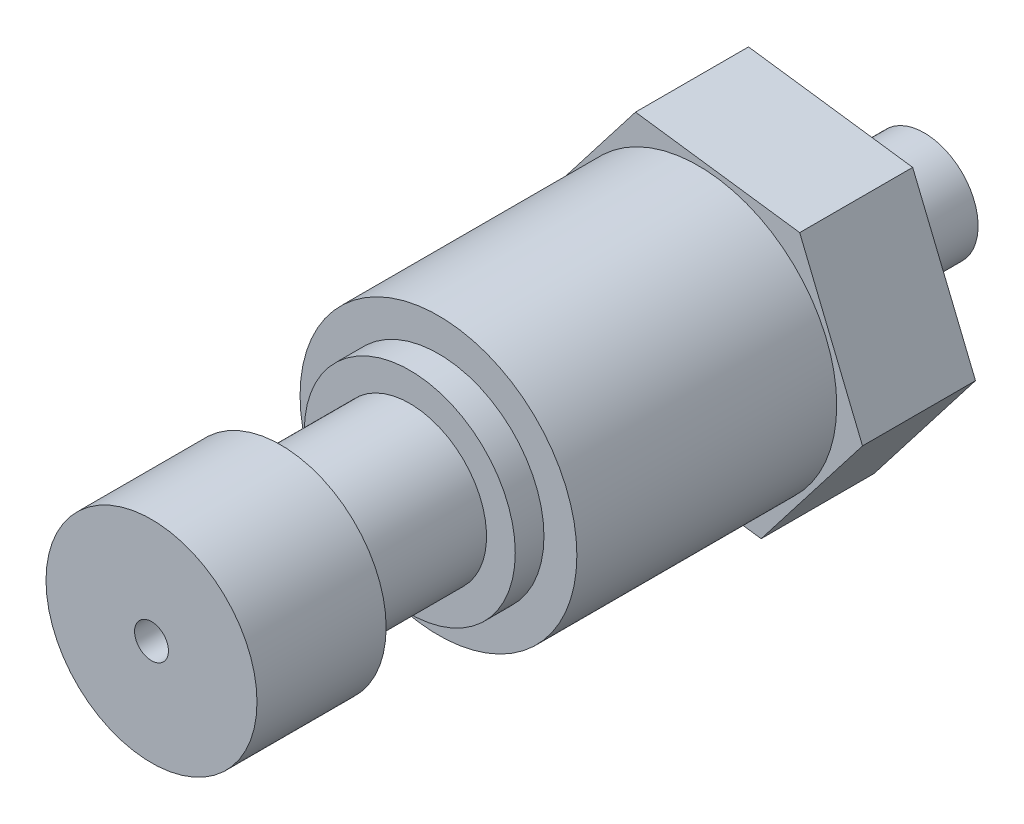
ISO-10303-21;
HEADER;
FILE_DESCRIPTION(('STEP AP214'),'2;1');
FILE_NAME('part.step','',(''),(''),'','','');
FILE_SCHEMA(('AUTOMOTIVE_DESIGN { 1 0 10303 214 1 1 1 1 }'));
ENDSEC;
DATA;
#1=APPLICATION_CONTEXT('core data for automotive mechanical design processes');
#2=APPLICATION_PROTOCOL_DEFINITION('international standard','automotive_design',2000,#1);
#3=PRODUCT_CONTEXT('',#1,'mechanical');
#4=PRODUCT('Part','Part','',(#3));
#5=PRODUCT_RELATED_PRODUCT_CATEGORY('part','',(#4));
#6=PRODUCT_DEFINITION_FORMATION('','',#4);
#7=PRODUCT_DEFINITION_CONTEXT('part definition',#1,'design');
#8=PRODUCT_DEFINITION('design','',#6,#7);
#9=PRODUCT_DEFINITION_SHAPE('','',#8);
#10=(LENGTH_UNIT() NAMED_UNIT(*) SI_UNIT(.MILLI.,.METRE.));
#11=(NAMED_UNIT(*) PLANE_ANGLE_UNIT() SI_UNIT($,.RADIAN.));
#12=(NAMED_UNIT(*) SI_UNIT($,.STERADIAN.) SOLID_ANGLE_UNIT());
#13=UNCERTAINTY_MEASURE_WITH_UNIT(LENGTH_MEASURE(1.E-05),#10,'distance_accuracy_value','');
#14=(GEOMETRIC_REPRESENTATION_CONTEXT(3) GLOBAL_UNCERTAINTY_ASSIGNED_CONTEXT((#13)) GLOBAL_UNIT_ASSIGNED_CONTEXT((#10,
#11,#12)) REPRESENTATION_CONTEXT('',''));
#15=CARTESIAN_POINT('',(0.,0.,0.));
#16=DIRECTION('',(0.,0.,1.));
#17=DIRECTION('',(1.,0.,0.));
#18=AXIS2_PLACEMENT_3D('',#15,#16,#17);
#19=CARTESIAN_POINT('',(5.56012094670705,-13.5697600712512,10.));
#20=DIRECTION('',(-0.79102119547338,0.611788744839152,0.));
#21=DIRECTION('',(-0.611788744839152,-0.79102119547338,0.));
#22=AXIS2_PLACEMENT_3D('',#19,#20,#21);
#23=PLANE('',#22);
#24=DIRECTION('',(0.611788744839152,0.79102119547338,0.));
#25=VECTOR('',#24,1.);
#26=CARTESIAN_POINT('',(5.56012094670705,-13.5697600712512,0.));
#27=LINE('',#26,#25);
#28=CARTESIAN_POINT('',(5.56012094670705,-13.5697600712512,0.));
#29=VERTEX_POINT('',#28);
#30=CARTESIAN_POINT('',(14.5318174183168,-1.96967404766329,0.));
#31=VERTEX_POINT('',#30);
#32=EDGE_CURVE('E137',#29,#31,#27,.T.);
#33=ORIENTED_EDGE('',*,*,#32,.T.);
#34=DIRECTION('',(0.,0.,-1.));
#35=VECTOR('',#34,1.);
#36=CARTESIAN_POINT('',(14.5318174183168,-1.96967404766329,10.));
#37=LINE('',#36,#35);
#38=CARTESIAN_POINT('',(14.5318174183168,-1.96967404766329,10.));
#39=VERTEX_POINT('',#38);
#40=EDGE_CURVE('E48',#39,#31,#37,.T.);
#41=ORIENTED_EDGE('',*,*,#40,.F.);
#42=DIRECTION('',(0.611788744839152,0.79102119547338,0.));
#43=VECTOR('',#42,1.);
#44=CARTESIAN_POINT('',(5.56012094670705,-13.5697600712512,10.));
#45=LINE('',#44,#43);
#46=CARTESIAN_POINT('',(5.56012094670705,-13.5697600712512,10.));
#47=VERTEX_POINT('',#46);
#48=EDGE_CURVE('E154',#47,#39,#45,.T.);
#49=ORIENTED_EDGE('',*,*,#48,.F.);
#50=DIRECTION('',(0.,0.,-1.));
#51=VECTOR('',#50,1.);
#52=CARTESIAN_POINT('',(5.56012094670705,-13.5697600712512,10.));
#53=LINE('',#52,#51);
#54=EDGE_CURVE('E133',#47,#29,#53,.T.);
#55=ORIENTED_EDGE('',*,*,#54,.T.);
#56=EDGE_LOOP('',(#33,#41,#49,#55));
#57=FACE_BOUND('',#56,.T.);
#58=ADVANCED_FACE('F45',(#57),#23,.F.);
#59=CARTESIAN_POINT('',(14.5318174183168,-1.96967404766329,10.));
#60=DIRECTION('',(-0.925335192516792,-0.379150077792306,0.));
#61=DIRECTION('',(0.379150077792306,-0.925335192516792,0.));
#62=AXIS2_PLACEMENT_3D('',#59,#60,#61);
#63=PLANE('',#62);
#64=DIRECTION('',(-0.379150077792306,0.925335192516792,0.));
#65=VECTOR('',#64,1.);
#66=CARTESIAN_POINT('',(14.5318174183168,-1.96967404766329,0.));
#67=LINE('',#66,#65);
#68=CARTESIAN_POINT('',(8.97169647160972,11.6000860235879,0.));
#69=VERTEX_POINT('',#68);
#70=EDGE_CURVE('E141',#31,#69,#67,.T.);
#71=ORIENTED_EDGE('',*,*,#70,.T.);
#72=DIRECTION('',(0.,0.,-1.));
#73=VECTOR('',#72,1.);
#74=CARTESIAN_POINT('',(8.97169647160972,11.6000860235879,10.));
#75=LINE('',#74,#73);
#76=CARTESIAN_POINT('',(8.97169647160972,11.6000860235879,10.));
#77=VERTEX_POINT('',#76);
#78=EDGE_CURVE('E160',#77,#69,#75,.T.);
#79=ORIENTED_EDGE('',*,*,#78,.F.);
#80=DIRECTION('',(-0.379150077792306,0.925335192516792,0.));
#81=VECTOR('',#80,1.);
#82=CARTESIAN_POINT('',(14.5318174183168,-1.96967404766329,10.));
#83=LINE('',#82,#81);
#84=EDGE_CURVE('E102',#39,#77,#83,.T.);
#85=ORIENTED_EDGE('',*,*,#84,.F.);
#86=ORIENTED_EDGE('',*,*,#40,.T.);
#87=EDGE_LOOP('',(#71,#79,#85,#86));
#88=FACE_BOUND('',#87,.T.);
#89=ADVANCED_FACE('F241',(#88),#63,.F.);
#90=CARTESIAN_POINT('',(8.97169647160972,11.6000860235879,10.));
#91=DIRECTION('',(-0.134313997043412,-0.990938822631459,0.));
#92=DIRECTION('',(0.990938822631459,-0.134313997043412,0.));
#93=AXIS2_PLACEMENT_3D('',#90,#91,#92);
#94=PLANE('',#93);
#95=DIRECTION('',(-0.990938822631459,0.134313997043412,0.));
#96=VECTOR('',#95,1.);
#97=CARTESIAN_POINT('',(8.97169647160972,11.6000860235879,0.));
#98=LINE('',#97,#96);
#99=CARTESIAN_POINT('',(-5.56012094670705,13.5697600712512,0.));
#100=VERTEX_POINT('',#99);
#101=EDGE_CURVE('E145',#69,#100,#98,.T.);
#102=ORIENTED_EDGE('',*,*,#101,.T.);
#103=DIRECTION('',(0.,0.,-1.));
#104=VECTOR('',#103,1.);
#105=CARTESIAN_POINT('',(-5.56012094670705,13.5697600712512,10.));
#106=LINE('',#105,#104);
#107=CARTESIAN_POINT('',(-5.56012094670705,13.5697600712512,10.));
#108=VERTEX_POINT('',#107);
#109=EDGE_CURVE('E126',#108,#100,#106,.T.);
#110=ORIENTED_EDGE('',*,*,#109,.F.);
#111=DIRECTION('',(-0.990938822631459,0.134313997043412,0.));
#112=VECTOR('',#111,1.);
#113=CARTESIAN_POINT('',(8.97169647160972,11.6000860235879,10.));
#114=LINE('',#113,#112);
#115=EDGE_CURVE('E115',#77,#108,#114,.T.);
#116=ORIENTED_EDGE('',*,*,#115,.F.);
#117=ORIENTED_EDGE('',*,*,#78,.T.);
#118=EDGE_LOOP('',(#102,#110,#116,#117));
#119=FACE_BOUND('',#118,.T.);
#120=ADVANCED_FACE('F246',(#119),#94,.F.);
#121=CARTESIAN_POINT('',(-5.56012094670705,13.5697600712512,10.));
#122=DIRECTION('',(0.791021195473379,-0.611788744839153,0.));
#123=DIRECTION('',(0.611788744839153,0.791021195473379,0.));
#124=AXIS2_PLACEMENT_3D('',#121,#122,#123);
#125=PLANE('',#124);
#126=DIRECTION('',(-0.611788744839153,-0.791021195473379,0.));
#127=VECTOR('',#126,1.);
#128=CARTESIAN_POINT('',(-5.56012094670705,13.5697600712512,0.));
#129=LINE('',#128,#127);
#130=CARTESIAN_POINT('',(-14.5318174183168,1.9696740476633,0.));
#131=VERTEX_POINT('',#130);
#132=EDGE_CURVE('E124',#100,#131,#129,.T.);
#133=ORIENTED_EDGE('',*,*,#132,.T.);
#134=DIRECTION('',(0.,0.,-1.));
#135=VECTOR('',#134,1.);
#136=CARTESIAN_POINT('',(-14.5318174183168,1.9696740476633,10.));
#137=LINE('',#136,#135);
#138=CARTESIAN_POINT('',(-14.5318174183168,1.9696740476633,10.));
#139=VERTEX_POINT('',#138);
#140=EDGE_CURVE('E121',#139,#131,#137,.T.);
#141=ORIENTED_EDGE('',*,*,#140,.F.);
#142=DIRECTION('',(-0.611788744839153,-0.791021195473379,0.));
#143=VECTOR('',#142,1.);
#144=CARTESIAN_POINT('',(-5.56012094670705,13.5697600712512,10.));
#145=LINE('',#144,#143);
#146=EDGE_CURVE('E109',#108,#139,#145,.T.);
#147=ORIENTED_EDGE('',*,*,#146,.F.);
#148=ORIENTED_EDGE('',*,*,#109,.T.);
#149=EDGE_LOOP('',(#133,#141,#147,#148));
#150=FACE_BOUND('',#149,.T.);
#151=ADVANCED_FACE('F122',(#150),#125,.F.);
#152=CARTESIAN_POINT('',(-14.5318174183168,1.9696740476633,10.));
#153=DIRECTION('',(0.925335192516792,0.379150077792306,0.));
#154=DIRECTION('',(-0.379150077792306,0.925335192516792,0.));
#155=AXIS2_PLACEMENT_3D('',#152,#153,#154);
#156=PLANE('',#155);
#157=DIRECTION('',(0.379150077792306,-0.925335192516792,0.));
#158=VECTOR('',#157,1.);
#159=CARTESIAN_POINT('',(-14.5318174183168,1.9696740476633,0.));
#160=LINE('',#159,#158);
#161=CARTESIAN_POINT('',(-8.97169647160973,-11.6000860235879,0.));
#162=VERTEX_POINT('',#161);
#163=EDGE_CURVE('E87',#131,#162,#160,.T.);
#164=ORIENTED_EDGE('',*,*,#163,.T.);
#165=DIRECTION('',(0.,0.,-1.));
#166=VECTOR('',#165,1.);
#167=CARTESIAN_POINT('',(-8.97169647160973,-11.6000860235879,10.));
#168=LINE('',#167,#166);
#169=CARTESIAN_POINT('',(-8.97169647160973,-11.6000860235879,10.));
#170=VERTEX_POINT('',#169);
#171=EDGE_CURVE('E127',#170,#162,#168,.T.);
#172=ORIENTED_EDGE('',*,*,#171,.F.);
#173=DIRECTION('',(0.379150077792306,-0.925335192516792,0.));
#174=VECTOR('',#173,1.);
#175=CARTESIAN_POINT('',(-14.5318174183168,1.9696740476633,10.));
#176=LINE('',#175,#174);
#177=EDGE_CURVE('E113',#139,#170,#176,.T.);
#178=ORIENTED_EDGE('',*,*,#177,.F.);
#179=ORIENTED_EDGE('',*,*,#140,.T.);
#180=EDGE_LOOP('',(#164,#172,#178,#179));
#181=FACE_BOUND('',#180,.T.);
#182=ADVANCED_FACE('F129',(#181),#156,.F.);
#183=CARTESIAN_POINT('',(-8.97169647160973,-11.6000860235879,10.));
#184=DIRECTION('',(0.134313997043413,0.990938822631459,0.));
#185=DIRECTION('',(-0.990938822631459,0.134313997043413,0.));
#186=AXIS2_PLACEMENT_3D('',#183,#184,#185);
#187=PLANE('',#186);
#188=DIRECTION('',(0.990938822631459,-0.134313997043413,0.));
#189=VECTOR('',#188,1.);
#190=CARTESIAN_POINT('',(-8.97169647160973,-11.6000860235879,0.));
#191=LINE('',#190,#189);
#192=EDGE_CURVE('E93',#162,#29,#191,.T.);
#193=ORIENTED_EDGE('',*,*,#192,.T.);
#194=ORIENTED_EDGE('',*,*,#54,.F.);
#195=DIRECTION('',(0.990938822631459,-0.134313997043413,0.));
#196=VECTOR('',#195,1.);
#197=CARTESIAN_POINT('',(-8.97169647160973,-11.6000860235879,10.));
#198=LINE('',#197,#196);
#199=EDGE_CURVE('E64',#170,#47,#198,.T.);
#200=ORIENTED_EDGE('',*,*,#199,.F.);
#201=ORIENTED_EDGE('',*,*,#171,.T.);
#202=EDGE_LOOP('',(#193,#194,#200,#201));
#203=FACE_BOUND('',#202,.T.);
#204=ADVANCED_FACE('F259',(#203),#187,.F.);
#205=CARTESIAN_POINT('',(0.,0.,10.));
#206=DIRECTION('',(0.,0.,1.));
#207=DIRECTION('',(1.,0.,0.));
#208=AXIS2_PLACEMENT_3D('',#205,#206,#207);
#209=PLANE('',#208);
#210=CARTESIAN_POINT('',(0.,0.,10.));
#211=DIRECTION('',(0.,0.,1.));
#212=DIRECTION('',(1.,0.,0.));
#213=AXIS2_PLACEMENT_3D('',#210,#211,#212);
#214=CIRCLE('',#213,12.25);
#215=CARTESIAN_POINT('',(12.25,0.,10.));
#216=VERTEX_POINT('',#215);
#217=EDGE_CURVE('E166',#216,#216,#214,.T.);
#218=ORIENTED_EDGE('',*,*,#217,.F.);
#219=EDGE_LOOP('',(#218));
#220=FACE_BOUND('',#219,.T.);
#221=ORIENTED_EDGE('',*,*,#48,.T.);
#222=ORIENTED_EDGE('',*,*,#84,.T.);
#223=ORIENTED_EDGE('',*,*,#115,.T.);
#224=ORIENTED_EDGE('',*,*,#146,.T.);
#225=ORIENTED_EDGE('',*,*,#177,.T.);
#226=ORIENTED_EDGE('',*,*,#199,.T.);
#227=EDGE_LOOP('',(#221,#222,#223,#224,#225,#226));
#228=FACE_BOUND('',#227,.T.);
#229=ADVANCED_FACE('F111',(#220,#228),#209,.T.);
#230=CARTESIAN_POINT('',(0.,0.,0.));
#231=DIRECTION('',(0.,0.,1.));
#232=DIRECTION('',(1.,0.,0.));
#233=AXIS2_PLACEMENT_3D('',#230,#231,#232);
#234=PLANE('',#233);
#235=CARTESIAN_POINT('',(0.,0.,0.));
#236=DIRECTION('',(0.,0.,-1.));
#237=DIRECTION('',(-1.,0.,0.));
#238=AXIS2_PLACEMENT_3D('',#235,#236,#237);
#239=CIRCLE('',#238,4.7625);
#240=CARTESIAN_POINT('',(-4.7625,0.,0.));
#241=VERTEX_POINT('',#240);
#242=EDGE_CURVE('E170',#241,#241,#239,.T.);
#243=ORIENTED_EDGE('',*,*,#242,.F.);
#244=EDGE_LOOP('',(#243));
#245=FACE_BOUND('',#244,.T.);
#246=ORIENTED_EDGE('',*,*,#32,.F.);
#247=ORIENTED_EDGE('',*,*,#192,.F.);
#248=ORIENTED_EDGE('',*,*,#163,.F.);
#249=ORIENTED_EDGE('',*,*,#132,.F.);
#250=ORIENTED_EDGE('',*,*,#101,.F.);
#251=ORIENTED_EDGE('',*,*,#70,.F.);
#252=EDGE_LOOP('',(#246,#247,#248,#249,#250,#251));
#253=FACE_BOUND('',#252,.T.);
#254=ADVANCED_FACE('F231',(#245,#253),#234,.F.);
#255=CARTESIAN_POINT('',(0.,0.,33.));
#256=DIRECTION('',(0.,0.,-1.));
#257=DIRECTION('',(-1.,0.,0.));
#258=AXIS2_PLACEMENT_3D('',#255,#256,#257);
#259=CYLINDRICAL_SURFACE('',#258,12.25);
#260=CARTESIAN_POINT('',(0.,0.,33.));
#261=DIRECTION('',(0.,0.,1.));
#262=DIRECTION('',(1.,0.,0.));
#263=AXIS2_PLACEMENT_3D('',#260,#261,#262);
#264=CIRCLE('',#263,12.25);
#265=CARTESIAN_POINT('',(12.25,0.,33.));
#266=VERTEX_POINT('',#265);
#267=EDGE_CURVE('E142',#266,#266,#264,.T.);
#268=ORIENTED_EDGE('',*,*,#267,.F.);
#269=EDGE_LOOP('',(#268));
#270=FACE_BOUND('',#269,.T.);
#271=ORIENTED_EDGE('',*,*,#217,.T.);
#272=EDGE_LOOP('',(#271));
#273=FACE_BOUND('',#272,.T.);
#274=ADVANCED_FACE('F226',(#270,#273),#259,.T.);
#275=CARTESIAN_POINT('',(0.,0.,33.));
#276=DIRECTION('',(0.,0.,1.));
#277=DIRECTION('',(1.,0.,0.));
#278=AXIS2_PLACEMENT_3D('',#275,#276,#277);
#279=PLANE('',#278);
#280=CARTESIAN_POINT('',(0.,0.,33.));
#281=DIRECTION('',(0.,0.,1.));
#282=DIRECTION('',(1.,0.,0.));
#283=AXIS2_PLACEMENT_3D('',#280,#281,#282);
#284=CIRCLE('',#283,9.33749047328459);
#285=CARTESIAN_POINT('',(9.33749047328459,0.,33.));
#286=VERTEX_POINT('',#285);
#287=EDGE_CURVE('E55',#286,#286,#284,.T.);
#288=ORIENTED_EDGE('',*,*,#287,.F.);
#289=EDGE_LOOP('',(#288));
#290=FACE_BOUND('',#289,.T.);
#291=ORIENTED_EDGE('',*,*,#267,.T.);
#292=EDGE_LOOP('',(#291));
#293=FACE_BOUND('',#292,.T.);
#294=ADVANCED_FACE('F222',(#290,#293),#279,.T.);
#295=CARTESIAN_POINT('',(0.,0.,-10.));
#296=DIRECTION('',(0.,0.,1.));
#297=DIRECTION('',(1.,0.,0.));
#298=AXIS2_PLACEMENT_3D('',#295,#296,#297);
#299=CYLINDRICAL_SURFACE('',#298,4.7625);
#300=CARTESIAN_POINT('',(0.,0.,-10.));
#301=DIRECTION('',(0.,0.,-1.));
#302=DIRECTION('',(-1.,0.,0.));
#303=AXIS2_PLACEMENT_3D('',#300,#301,#302);
#304=CIRCLE('',#303,4.7625);
#305=CARTESIAN_POINT('',(-4.7625,0.,-10.));
#306=VERTEX_POINT('',#305);
#307=EDGE_CURVE('E186',#306,#306,#304,.T.);
#308=ORIENTED_EDGE('',*,*,#307,.F.);
#309=EDGE_LOOP('',(#308));
#310=FACE_BOUND('',#309,.T.);
#311=ORIENTED_EDGE('',*,*,#242,.T.);
#312=EDGE_LOOP('',(#311));
#313=FACE_BOUND('',#312,.T.);
#314=ADVANCED_FACE('F225',(#310,#313),#299,.T.);
#315=CARTESIAN_POINT('',(0.,0.,-10.));
#316=DIRECTION('',(0.,0.,-1.));
#317=DIRECTION('',(-1.,0.,0.));
#318=AXIS2_PLACEMENT_3D('',#315,#316,#317);
#319=PLANE('',#318);
#320=CARTESIAN_POINT('',(0.,0.,-9.99999999999999));
#321=DIRECTION('',(0.,0.,1.));
#322=DIRECTION('',(1.,0.,0.));
#323=AXIS2_PLACEMENT_3D('',#320,#321,#322);
#324=CIRCLE('',#323,1.5);
#325=CARTESIAN_POINT('',(1.5,0.,-9.99999999999999));
#326=VERTEX_POINT('',#325);
#327=EDGE_CURVE('E205',#326,#326,#324,.T.);
#328=ORIENTED_EDGE('',*,*,#327,.T.);
#329=EDGE_LOOP('',(#328));
#330=FACE_BOUND('',#329,.T.);
#331=ORIENTED_EDGE('',*,*,#307,.T.);
#332=EDGE_LOOP('',(#331));
#333=FACE_BOUND('',#332,.T.);
#334=ADVANCED_FACE('F319',(#330,#333),#319,.T.);
#335=CARTESIAN_POINT('',(0.,0.,35.54));
#336=DIRECTION('',(0.,0.,-1.));
#337=DIRECTION('',(-1.,0.,0.));
#338=AXIS2_PLACEMENT_3D('',#335,#336,#337);
#339=CYLINDRICAL_SURFACE('',#338,9.33749047328459);
#340=CARTESIAN_POINT('',(0.,0.,35.54));
#341=DIRECTION('',(0.,0.,1.));
#342=DIRECTION('',(1.,0.,0.));
#343=AXIS2_PLACEMENT_3D('',#340,#341,#342);
#344=CIRCLE('',#343,9.33749047328459);
#345=CARTESIAN_POINT('',(9.33749047328459,0.,35.54));
#346=VERTEX_POINT('',#345);
#347=EDGE_CURVE('E189',#346,#346,#344,.T.);
#348=ORIENTED_EDGE('',*,*,#347,.F.);
#349=EDGE_LOOP('',(#348));
#350=FACE_BOUND('',#349,.T.);
#351=ORIENTED_EDGE('',*,*,#287,.T.);
#352=EDGE_LOOP('',(#351));
#353=FACE_BOUND('',#352,.T.);
#354=ADVANCED_FACE('F220',(#350,#353),#339,.T.);
#355=CARTESIAN_POINT('',(0.,0.,35.54));
#356=DIRECTION('',(0.,0.,1.));
#357=DIRECTION('',(1.,0.,0.));
#358=AXIS2_PLACEMENT_3D('',#355,#356,#357);
#359=PLANE('',#358);
#360=CARTESIAN_POINT('',(0.,0.,35.54));
#361=DIRECTION('',(0.,0.,1.));
#362=DIRECTION('',(1.,0.,0.));
#363=AXIS2_PLACEMENT_3D('',#360,#361,#362);
#364=CIRCLE('',#363,6.7937183173805);
#365=CARTESIAN_POINT('',(-6.7937183173805,0.,35.54));
#366=VERTEX_POINT('',#365);
#367=EDGE_CURVE('E11',#366,#366,#364,.T.);
#368=ORIENTED_EDGE('',*,*,#367,.F.);
#369=EDGE_LOOP('',(#368));
#370=FACE_BOUND('',#369,.T.);
#371=ORIENTED_EDGE('',*,*,#347,.T.);
#372=EDGE_LOOP('',(#371));
#373=FACE_BOUND('',#372,.T.);
#374=ADVANCED_FACE('F336',(#370,#373),#359,.T.);
#375=CARTESIAN_POINT('',(0.,0.,46.97));
#376=DIRECTION('',(0.,0.,-1.));
#377=DIRECTION('',(-1.,0.,0.));
#378=AXIS2_PLACEMENT_3D('',#375,#376,#377);
#379=CYLINDRICAL_SURFACE('',#378,6.7937183173805);
#380=CARTESIAN_POINT('',(0.,0.,46.97));
#381=DIRECTION('',(0.,0.,1.));
#382=DIRECTION('',(1.,0.,0.));
#383=AXIS2_PLACEMENT_3D('',#380,#381,#382);
#384=CIRCLE('',#383,6.7937183173805);
#385=CARTESIAN_POINT('',(-6.7937183173805,0.,46.97));
#386=VERTEX_POINT('',#385);
#387=EDGE_CURVE('E193',#386,#386,#384,.T.);
#388=CARTESIAN_POINT('',(-6.7937183173805,0.,46.97));
#389=CARTESIAN_POINT('',(-6.7937183173805,0.,46.8509375));
#390=CARTESIAN_POINT('',(-6.7937183173805,0.,46.731875));
#391=CARTESIAN_POINT('',(-6.7937183173805,0.,46.49375));
#392=CARTESIAN_POINT('',(-6.7937183173805,0.,46.3746875));
#393=CARTESIAN_POINT('',(-6.7937183173805,0.,46.1365625));
#394=CARTESIAN_POINT('',(-6.7937183173805,0.,46.0175));
#395=CARTESIAN_POINT('',(-6.7937183173805,0.,45.779375));
#396=CARTESIAN_POINT('',(-6.7937183173805,0.,45.6603125));
#397=CARTESIAN_POINT('',(-6.7937183173805,0.,45.4221875));
#398=CARTESIAN_POINT('',(-6.7937183173805,0.,45.303125));
#399=CARTESIAN_POINT('',(-6.7937183173805,0.,45.065));
#400=CARTESIAN_POINT('',(-6.7937183173805,0.,44.9459375));
#401=CARTESIAN_POINT('',(-6.7937183173805,0.,44.7078125));
#402=CARTESIAN_POINT('',(-6.7937183173805,0.,44.58875));
#403=CARTESIAN_POINT('',(-6.7937183173805,0.,44.350625));
#404=CARTESIAN_POINT('',(-6.7937183173805,0.,44.2315625));
#405=CARTESIAN_POINT('',(-6.7937183173805,0.,43.9934375));
#406=CARTESIAN_POINT('',(-6.7937183173805,0.,43.874375));
#407=CARTESIAN_POINT('',(-6.7937183173805,0.,43.63625));
#408=CARTESIAN_POINT('',(-6.7937183173805,0.,43.5171875));
#409=CARTESIAN_POINT('',(-6.7937183173805,0.,43.2790625));
#410=CARTESIAN_POINT('',(-6.7937183173805,0.,43.16));
#411=CARTESIAN_POINT('',(-6.7937183173805,0.,42.921875));
#412=CARTESIAN_POINT('',(-6.7937183173805,0.,42.8028125));
#413=CARTESIAN_POINT('',(-6.7937183173805,0.,42.5646875));
#414=CARTESIAN_POINT('',(-6.7937183173805,0.,42.445625));
#415=CARTESIAN_POINT('',(-6.7937183173805,0.,42.2075));
#416=CARTESIAN_POINT('',(-6.7937183173805,0.,42.0884375));
#417=CARTESIAN_POINT('',(-6.7937183173805,0.,41.8503125));
#418=CARTESIAN_POINT('',(-6.7937183173805,0.,41.73125));
#419=CARTESIAN_POINT('',(-6.7937183173805,0.,41.493125));
#420=CARTESIAN_POINT('',(-6.7937183173805,0.,41.3740625));
#421=CARTESIAN_POINT('',(-6.7937183173805,0.,41.1359375));
#422=CARTESIAN_POINT('',(-6.7937183173805,0.,41.016875));
#423=CARTESIAN_POINT('',(-6.7937183173805,0.,40.77875));
#424=CARTESIAN_POINT('',(-6.7937183173805,0.,40.6596875));
#425=CARTESIAN_POINT('',(-6.7937183173805,0.,40.4215625));
#426=CARTESIAN_POINT('',(-6.7937183173805,0.,40.3025));
#427=CARTESIAN_POINT('',(-6.7937183173805,0.,40.064375));
#428=CARTESIAN_POINT('',(-6.7937183173805,0.,39.9453125));
#429=CARTESIAN_POINT('',(-6.7937183173805,0.,39.7071875));
#430=CARTESIAN_POINT('',(-6.7937183173805,0.,39.588125));
#431=CARTESIAN_POINT('',(-6.7937183173805,0.,39.35));
#432=CARTESIAN_POINT('',(-6.7937183173805,0.,39.2309375));
#433=CARTESIAN_POINT('',(-6.7937183173805,0.,38.9928125));
#434=CARTESIAN_POINT('',(-6.7937183173805,0.,38.87375));
#435=CARTESIAN_POINT('',(-6.7937183173805,0.,38.635625));
#436=CARTESIAN_POINT('',(-6.7937183173805,0.,38.5165625));
#437=CARTESIAN_POINT('',(-6.7937183173805,0.,38.2784375));
#438=CARTESIAN_POINT('',(-6.7937183173805,0.,38.159375));
#439=CARTESIAN_POINT('',(-6.7937183173805,0.,37.92125));
#440=CARTESIAN_POINT('',(-6.7937183173805,0.,37.8021875));
#441=CARTESIAN_POINT('',(-6.7937183173805,0.,37.5640625));
#442=CARTESIAN_POINT('',(-6.7937183173805,0.,37.445));
#443=CARTESIAN_POINT('',(-6.7937183173805,0.,37.206875));
#444=CARTESIAN_POINT('',(-6.7937183173805,0.,37.0878125));
#445=CARTESIAN_POINT('',(-6.7937183173805,0.,36.8496875));
#446=CARTESIAN_POINT('',(-6.7937183173805,0.,36.730625));
#447=CARTESIAN_POINT('',(-6.7937183173805,0.,36.4925));
#448=CARTESIAN_POINT('',(-6.7937183173805,0.,36.3734375));
#449=CARTESIAN_POINT('',(-6.7937183173805,0.,36.1353125));
#450=CARTESIAN_POINT('',(-6.7937183173805,0.,36.01625));
#451=CARTESIAN_POINT('',(-6.7937183173805,0.,35.778125));
#452=CARTESIAN_POINT('',(-6.7937183173805,0.,35.6590625));
#453=CARTESIAN_POINT('',(-6.7937183173805,0.,35.54));
#454=B_SPLINE_CURVE_WITH_KNOTS('',3,(#388,#389,#390,#391,#392,#393,#394,#395,#396,#397,#398,
#399,#400,#401,#402,#403,#404,#405,#406,#407,#408,#409,#410,#411,#412,#413,#414,#415,#416,#417,
#418,#419,#420,#421,#422,#423,#424,#425,#426,#427,#428,#429,#430,#431,#432,#433,#434,#435,#436,
#437,#438,#439,#440,#441,#442,#443,#444,#445,#446,#447,#448,#449,#450,#451,#452,#453),
.UNSPECIFIED.,.F.,.F.,(4,2,2,2,2,2,2,2,2,2,2,2,2,2,2,2,2,2,2,2,2,2,2,2,2,2,2,2,2,2,2,2,4),(0.,
0.357187500000002,0.714375000000003,1.0715625,1.42875000000001,1.7859375,2.143125,2.5003125,
2.85750000000001,3.21468750000001,3.571875,3.9290625,4.28625000000001,4.64343750000001,5.000625,
5.3578125,5.71500000000001,6.07218750000001,6.42937500000001,6.7865625,7.14375,7.50093750000001,
7.85812500000001,8.21531250000001,8.5725,8.92968750000001,9.28687500000001,9.64406250000001,
10.00125,10.3584375,10.715625,11.0728125,11.43),.UNSPECIFIED.);
#455=EDGE_CURVE('BSEAM345',#386,#366,#454,.T.);
#456=ORIENTED_EDGE('',*,*,#387,.F.);
#457=ORIENTED_EDGE('',*,*,#367,.T.);
#458=ORIENTED_EDGE('',*,*,#455,.T.);
#459=ORIENTED_EDGE('',*,*,#455,.F.);
#460=EDGE_LOOP('',(#456,#458,#457,#459));
#461=FACE_BOUND('',#460,.T.);
#462=ADVANCED_FACE('F345',(#461),#379,.T.);
#463=CARTESIAN_POINT('',(0.,0.,58.4));
#464=DIRECTION('',(0.,0.,-1.));
#465=DIRECTION('',(-1.,0.,0.));
#466=AXIS2_PLACEMENT_3D('',#463,#464,#465);
#467=CYLINDRICAL_SURFACE('',#466,9.33749047328459);
#468=CARTESIAN_POINT('',(0.,0.,58.4));
#469=DIRECTION('',(0.,0.,1.));
#470=DIRECTION('',(1.,0.,0.));
#471=AXIS2_PLACEMENT_3D('',#468,#469,#470);
#472=CIRCLE('',#471,9.33749047328459);
#473=CARTESIAN_POINT('',(-9.33749047328459,0.,58.4));
#474=VERTEX_POINT('',#473);
#475=EDGE_CURVE('E197',#474,#474,#472,.T.);
#476=CARTESIAN_POINT('',(0.,0.,46.97));
#477=DIRECTION('',(0.,0.,1.));
#478=DIRECTION('',(1.,0.,0.));
#479=AXIS2_PLACEMENT_3D('',#476,#477,#478);
#480=CIRCLE('',#479,9.33749047328459);
#481=CARTESIAN_POINT('',(-9.33749047328459,0.,46.97));
#482=VERTEX_POINT('',#481);
#483=EDGE_CURVE('E201',#482,#482,#480,.T.);
#484=CARTESIAN_POINT('',(-9.33749047328459,0.,58.4));
#485=CARTESIAN_POINT('',(-9.33749047328459,0.,58.2809375));
#486=CARTESIAN_POINT('',(-9.33749047328459,0.,58.161875));
#487=CARTESIAN_POINT('',(-9.33749047328459,0.,57.92375));
#488=CARTESIAN_POINT('',(-9.33749047328459,0.,57.8046875));
#489=CARTESIAN_POINT('',(-9.33749047328459,0.,57.5665625));
#490=CARTESIAN_POINT('',(-9.33749047328459,0.,57.4475));
#491=CARTESIAN_POINT('',(-9.33749047328459,0.,57.209375));
#492=CARTESIAN_POINT('',(-9.33749047328459,0.,57.0903125));
#493=CARTESIAN_POINT('',(-9.33749047328459,0.,56.8521875));
#494=CARTESIAN_POINT('',(-9.33749047328459,0.,56.733125));
#495=CARTESIAN_POINT('',(-9.33749047328459,0.,56.495));
#496=CARTESIAN_POINT('',(-9.33749047328459,0.,56.3759375));
#497=CARTESIAN_POINT('',(-9.33749047328459,0.,56.1378125));
#498=CARTESIAN_POINT('',(-9.33749047328459,0.,56.01875));
#499=CARTESIAN_POINT('',(-9.33749047328459,0.,55.780625));
#500=CARTESIAN_POINT('',(-9.33749047328459,0.,55.6615625));
#501=CARTESIAN_POINT('',(-9.33749047328459,0.,55.4234375));
#502=CARTESIAN_POINT('',(-9.33749047328459,0.,55.304375));
#503=CARTESIAN_POINT('',(-9.33749047328459,0.,55.06625));
#504=CARTESIAN_POINT('',(-9.33749047328459,0.,54.9471875));
#505=CARTESIAN_POINT('',(-9.33749047328459,0.,54.7090625));
#506=CARTESIAN_POINT('',(-9.33749047328459,0.,54.59));
#507=CARTESIAN_POINT('',(-9.33749047328459,0.,54.351875));
#508=CARTESIAN_POINT('',(-9.33749047328459,0.,54.2328125));
#509=CARTESIAN_POINT('',(-9.33749047328459,0.,53.9946875));
#510=CARTESIAN_POINT('',(-9.33749047328459,0.,53.875625));
#511=CARTESIAN_POINT('',(-9.33749047328459,0.,53.6375));
#512=CARTESIAN_POINT('',(-9.33749047328459,0.,53.5184375));
#513=CARTESIAN_POINT('',(-9.33749047328459,0.,53.2803125));
#514=CARTESIAN_POINT('',(-9.33749047328459,0.,53.16125));
#515=CARTESIAN_POINT('',(-9.33749047328459,0.,52.923125));
#516=CARTESIAN_POINT('',(-9.33749047328459,0.,52.8040625));
#517=CARTESIAN_POINT('',(-9.33749047328459,0.,52.5659375));
#518=CARTESIAN_POINT('',(-9.33749047328459,0.,52.446875));
#519=CARTESIAN_POINT('',(-9.33749047328459,0.,52.20875));
#520=CARTESIAN_POINT('',(-9.33749047328459,0.,52.0896875));
#521=CARTESIAN_POINT('',(-9.33749047328459,0.,51.8515625));
#522=CARTESIAN_POINT('',(-9.33749047328459,0.,51.7325));
#523=CARTESIAN_POINT('',(-9.33749047328459,0.,51.494375));
#524=CARTESIAN_POINT('',(-9.33749047328459,0.,51.3753125));
#525=CARTESIAN_POINT('',(-9.33749047328459,0.,51.1371875));
#526=CARTESIAN_POINT('',(-9.33749047328459,0.,51.018125));
#527=CARTESIAN_POINT('',(-9.33749047328459,0.,50.78));
#528=CARTESIAN_POINT('',(-9.33749047328459,0.,50.6609375));
#529=CARTESIAN_POINT('',(-9.33749047328459,0.,50.4228125));
#530=CARTESIAN_POINT('',(-9.33749047328459,0.,50.30375));
#531=CARTESIAN_POINT('',(-9.33749047328459,0.,50.065625));
#532=CARTESIAN_POINT('',(-9.33749047328459,0.,49.9465625));
#533=CARTESIAN_POINT('',(-9.33749047328459,0.,49.7084375));
#534=CARTESIAN_POINT('',(-9.33749047328459,0.,49.589375));
#535=CARTESIAN_POINT('',(-9.33749047328459,0.,49.35125));
#536=CARTESIAN_POINT('',(-9.33749047328459,0.,49.2321875));
#537=CARTESIAN_POINT('',(-9.33749047328459,0.,48.9940625));
#538=CARTESIAN_POINT('',(-9.33749047328459,0.,48.875));
#539=CARTESIAN_POINT('',(-9.33749047328459,0.,48.636875));
#540=CARTESIAN_POINT('',(-9.33749047328459,0.,48.5178125));
#541=CARTESIAN_POINT('',(-9.33749047328459,0.,48.2796875));
#542=CARTESIAN_POINT('',(-9.33749047328459,0.,48.160625));
#543=CARTESIAN_POINT('',(-9.33749047328459,0.,47.9225));
#544=CARTESIAN_POINT('',(-9.33749047328459,0.,47.8034375));
#545=CARTESIAN_POINT('',(-9.33749047328459,0.,47.5653125));
#546=CARTESIAN_POINT('',(-9.33749047328459,0.,47.44625));
#547=CARTESIAN_POINT('',(-9.33749047328459,0.,47.208125));
#548=CARTESIAN_POINT('',(-9.33749047328459,0.,47.0890625));
#549=CARTESIAN_POINT('',(-9.33749047328459,0.,46.97));
#550=B_SPLINE_CURVE_WITH_KNOTS('',3,(#484,#485,#486,#487,#488,#489,#490,#491,#492,#493,#494,
#495,#496,#497,#498,#499,#500,#501,#502,#503,#504,#505,#506,#507,#508,#509,#510,#511,#512,#513,
#514,#515,#516,#517,#518,#519,#520,#521,#522,#523,#524,#525,#526,#527,#528,#529,#530,#531,#532,
#533,#534,#535,#536,#537,#538,#539,#540,#541,#542,#543,#544,#545,#546,#547,#548,#549),
.UNSPECIFIED.,.F.,.F.,(4,2,2,2,2,2,2,2,2,2,2,2,2,2,2,2,2,2,2,2,2,2,2,2,2,2,2,2,2,2,2,2,4),(0.,
0.357187500000002,0.714375000000003,1.0715625,1.42875000000001,1.7859375,2.143125,2.5003125,
2.85750000000001,3.2146875,3.571875,3.9290625,4.28625000000001,4.6434375,5.000625,5.3578125,
5.71500000000001,6.07218750000001,6.429375,6.7865625,7.14375,7.50093750000001,7.85812500000001,
8.2153125,8.5725,8.92968750000001,9.286875,9.6440625,10.00125,10.3584375,10.715625,11.0728125,
11.43),.UNSPECIFIED.);
#551=EDGE_CURVE('BSEAM354',#474,#482,#550,.T.);
#552=ORIENTED_EDGE('',*,*,#475,.F.);
#553=ORIENTED_EDGE('',*,*,#483,.T.);
#554=ORIENTED_EDGE('',*,*,#551,.T.);
#555=ORIENTED_EDGE('',*,*,#551,.F.);
#556=EDGE_LOOP('',(#552,#554,#553,#555));
#557=FACE_BOUND('',#556,.T.);
#558=ADVANCED_FACE('F354',(#557),#467,.T.);
#559=CARTESIAN_POINT('',(0.,0.,58.4));
#560=DIRECTION('',(0.,0.,1.));
#561=DIRECTION('',(1.,0.,0.));
#562=AXIS2_PLACEMENT_3D('',#559,#560,#561);
#563=PLANE('',#562);
#564=CARTESIAN_POINT('',(0.,0.,58.4));
#565=DIRECTION('',(0.,0.,1.));
#566=DIRECTION('',(1.,0.,0.));
#567=AXIS2_PLACEMENT_3D('',#564,#565,#566);
#568=CIRCLE('',#567,1.5);
#569=CARTESIAN_POINT('',(1.5,0.,58.4));
#570=VERTEX_POINT('',#569);
#571=EDGE_CURVE('E209',#570,#570,#568,.T.);
#572=ORIENTED_EDGE('',*,*,#571,.F.);
#573=EDGE_LOOP('',(#572));
#574=FACE_BOUND('',#573,.T.);
#575=ORIENTED_EDGE('',*,*,#475,.T.);
#576=EDGE_LOOP('',(#575));
#577=FACE_BOUND('',#576,.T.);
#578=ADVANCED_FACE('F363',(#574,#577),#563,.T.);
#579=CARTESIAN_POINT('',(0.,0.,46.97));
#580=DIRECTION('',(0.,0.,1.));
#581=DIRECTION('',(1.,0.,0.));
#582=AXIS2_PLACEMENT_3D('',#579,#580,#581);
#583=PLANE('',#582);
#584=ORIENTED_EDGE('',*,*,#387,.T.);
#585=EDGE_LOOP('',(#584));
#586=FACE_BOUND('',#585,.T.);
#587=ORIENTED_EDGE('',*,*,#483,.F.);
#588=EDGE_LOOP('',(#587));
#589=FACE_BOUND('',#588,.T.);
#590=ADVANCED_FACE('F372',(#586,#589),#583,.F.);
#591=CARTESIAN_POINT('',(0.,0.,-9.99999999999999));
#592=DIRECTION('',(0.,0.,1.));
#593=DIRECTION('',(1.,0.,0.));
#594=AXIS2_PLACEMENT_3D('',#591,#592,#593);
#595=CYLINDRICAL_SURFACE('',#594,1.5);
#596=ORIENTED_EDGE('',*,*,#327,.F.);
#597=EDGE_LOOP('',(#596));
#598=FACE_BOUND('',#597,.T.);
#599=ORIENTED_EDGE('',*,*,#571,.T.);
#600=EDGE_LOOP('',(#599));
#601=FACE_BOUND('',#600,.T.);
#602=ADVANCED_FACE('F381',(#598,#601),#595,.F.);
#603=CLOSED_SHELL('',(#58,#89,#120,#151,#182,#204,#229,#254,#274,#294,#314,#334,#354,#374,#462,
#558,#578,#590,#602));
#604=MANIFOLD_SOLID_BREP('B2',#603);
#605=ADVANCED_BREP_SHAPE_REPRESENTATION('',(#18,#604),#14);
#606=SHAPE_DEFINITION_REPRESENTATION(#9,#605);
ENDSEC;
END-ISO-10303-21;
